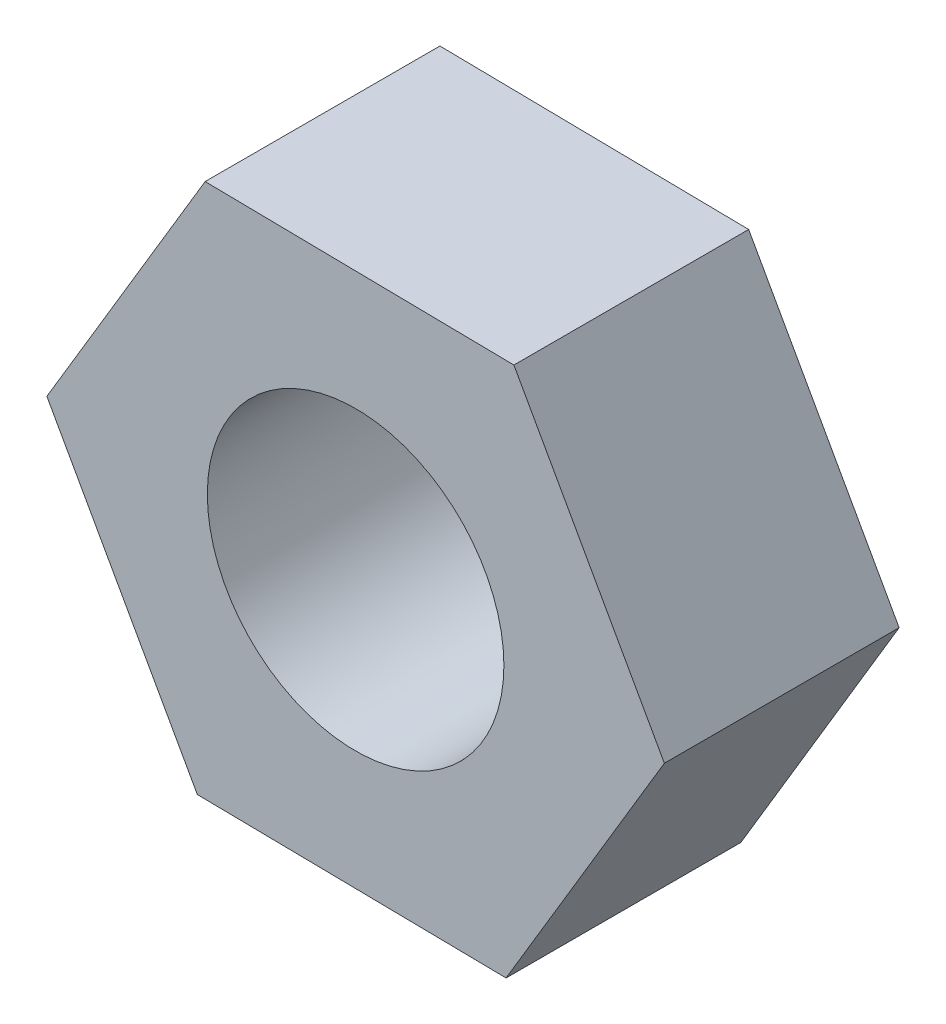
ISO-10303-21;
HEADER;
FILE_DESCRIPTION(('STEP AP214'),'2;1');
FILE_NAME('part.step','',(''),(''),'','','');
FILE_SCHEMA(('AUTOMOTIVE_DESIGN { 1 0 10303 214 1 1 1 1 }'));
ENDSEC;
DATA;
#1=APPLICATION_CONTEXT('core data for automotive mechanical design processes');
#2=APPLICATION_PROTOCOL_DEFINITION('international standard','automotive_design',2000,#1);
#3=PRODUCT_CONTEXT('',#1,'mechanical');
#4=PRODUCT('Part','Part','',(#3));
#5=PRODUCT_RELATED_PRODUCT_CATEGORY('part','',(#4));
#6=PRODUCT_DEFINITION_FORMATION('','',#4);
#7=PRODUCT_DEFINITION_CONTEXT('part definition',#1,'design');
#8=PRODUCT_DEFINITION('design','',#6,#7);
#9=PRODUCT_DEFINITION_SHAPE('','',#8);
#10=(LENGTH_UNIT() NAMED_UNIT(*) SI_UNIT(.MILLI.,.METRE.));
#11=(NAMED_UNIT(*) PLANE_ANGLE_UNIT() SI_UNIT($,.RADIAN.));
#12=(NAMED_UNIT(*) SI_UNIT($,.STERADIAN.) SOLID_ANGLE_UNIT());
#13=UNCERTAINTY_MEASURE_WITH_UNIT(LENGTH_MEASURE(1.E-05),#10,'distance_accuracy_value','');
#14=(GEOMETRIC_REPRESENTATION_CONTEXT(3) GLOBAL_UNCERTAINTY_ASSIGNED_CONTEXT((#13)) GLOBAL_UNIT_ASSIGNED_CONTEXT((#10,
#11,#12)) REPRESENTATION_CONTEXT('',''));
#15=CARTESIAN_POINT('',(0.,0.,0.));
#16=DIRECTION('',(0.,0.,1.));
#17=DIRECTION('',(1.,0.,0.));
#18=AXIS2_PLACEMENT_3D('',#15,#16,#17);
#19=CARTESIAN_POINT('',(3.1232464747736,-0.0456742576762376,2.3749));
#20=DIRECTION('',(-0.873244016784411,-0.487283169368928,0.));
#21=DIRECTION('',(0.487283169368928,-0.873244016784411,0.));
#22=AXIS2_PLACEMENT_3D('',#19,#20,#21);
#23=PLANE('',#22);
#24=DIRECTION('',(-0.487283169368928,0.873244016784411,0.));
#25=VECTOR('',#24,1.);
#26=CARTESIAN_POINT('',(3.1232464747736,-0.0456742576762376,0.));
#27=LINE('',#26,#25);
#28=CARTESIAN_POINT('',(3.1232464747736,-0.0456742576762376,0.));
#29=VERTEX_POINT('',#28);
#30=CARTESIAN_POINT('',(1.60117830483342,2.68197366059601,0.));
#31=VERTEX_POINT('',#30);
#32=EDGE_CURVE('E120',#29,#31,#27,.T.);
#33=ORIENTED_EDGE('',*,*,#32,.T.);
#34=DIRECTION('',(0.,0.,-1.));
#35=VECTOR('',#34,1.);
#36=CARTESIAN_POINT('',(1.60117830483342,2.68197366059601,2.3749));
#37=LINE('',#36,#35);
#38=CARTESIAN_POINT('',(1.60117830483342,2.68197366059601,2.3749));
#39=VERTEX_POINT('',#38);
#40=EDGE_CURVE('E11',#39,#31,#37,.T.);
#41=ORIENTED_EDGE('',*,*,#40,.F.);
#42=DIRECTION('',(-0.487283169368928,0.873244016784411,0.));
#43=VECTOR('',#42,1.);
#44=CARTESIAN_POINT('',(3.1232464747736,-0.0456742576762376,2.3749));
#45=LINE('',#44,#43);
#46=CARTESIAN_POINT('',(3.1232464747736,-0.0456742576762376,2.3749));
#47=VERTEX_POINT('',#46);
#48=EDGE_CURVE('E131',#47,#39,#45,.T.);
#49=ORIENTED_EDGE('',*,*,#48,.F.);
#50=DIRECTION('',(0.,0.,-1.));
#51=VECTOR('',#50,1.);
#52=CARTESIAN_POINT('',(3.1232464747736,-0.0456742576762376,2.3749));
#53=LINE('',#52,#51);
#54=EDGE_CURVE('E116',#47,#29,#53,.T.);
#55=ORIENTED_EDGE('',*,*,#54,.T.);
#56=EDGE_LOOP('',(#33,#41,#49,#55));
#57=FACE_BOUND('',#56,.T.);
#58=ADVANCED_FACE('F36',(#57),#23,.F.);
#59=CARTESIAN_POINT('',(1.60117830483342,2.68197366059601,2.3749));
#60=DIRECTION('',(-0.0146224048821186,-0.999893086922529,0.));
#61=DIRECTION('',(0.999893086922529,-0.0146224048821186,0.));
#62=AXIS2_PLACEMENT_3D('',#59,#60,#61);
#63=PLANE('',#62);
#64=DIRECTION('',(-0.999893086922529,0.0146224048821186,0.));
#65=VECTOR('',#64,1.);
#66=CARTESIAN_POINT('',(1.60117830483342,2.68197366059601,0.));
#67=LINE('',#66,#65);
#68=CARTESIAN_POINT('',(-1.52206816994018,2.72764791827225,0.));
#69=VERTEX_POINT('',#68);
#70=EDGE_CURVE('E123',#31,#69,#67,.T.);
#71=ORIENTED_EDGE('',*,*,#70,.T.);
#72=DIRECTION('',(0.,0.,-1.));
#73=VECTOR('',#72,1.);
#74=CARTESIAN_POINT('',(-1.52206816994018,2.72764791827225,2.3749));
#75=LINE('',#74,#73);
#76=CARTESIAN_POINT('',(-1.52206816994018,2.72764791827225,2.3749));
#77=VERTEX_POINT('',#76);
#78=EDGE_CURVE('E44',#77,#69,#75,.T.);
#79=ORIENTED_EDGE('',*,*,#78,.F.);
#80=DIRECTION('',(-0.999893086922529,0.0146224048821186,0.));
#81=VECTOR('',#80,1.);
#82=CARTESIAN_POINT('',(1.60117830483342,2.68197366059601,2.3749));
#83=LINE('',#82,#81);
#84=EDGE_CURVE('E89',#39,#77,#83,.T.);
#85=ORIENTED_EDGE('',*,*,#84,.F.);
#86=ORIENTED_EDGE('',*,*,#40,.T.);
#87=EDGE_LOOP('',(#71,#79,#85,#86));
#88=FACE_BOUND('',#87,.T.);
#89=ADVANCED_FACE('F156',(#88),#63,.F.);
#90=CARTESIAN_POINT('',(-1.52206816994018,2.72764791827225,2.3749));
#91=DIRECTION('',(0.858621611902292,-0.5126099175536,0.));
#92=DIRECTION('',(0.5126099175536,0.858621611902292,0.));
#93=AXIS2_PLACEMENT_3D('',#90,#91,#92);
#94=PLANE('',#93);
#95=DIRECTION('',(-0.5126099175536,-0.858621611902292,0.));
#96=VECTOR('',#95,1.);
#97=CARTESIAN_POINT('',(-1.52206816994018,2.72764791827225,0.));
#98=LINE('',#97,#96);
#99=CARTESIAN_POINT('',(-3.1232464747736,0.0456742576762379,0.));
#100=VERTEX_POINT('',#99);
#101=EDGE_CURVE('E126',#69,#100,#98,.T.);
#102=ORIENTED_EDGE('',*,*,#101,.T.);
#103=DIRECTION('',(0.,0.,-1.));
#104=VECTOR('',#103,1.);
#105=CARTESIAN_POINT('',(-3.1232464747736,0.0456742576762379,2.3749));
#106=LINE('',#105,#104);
#107=CARTESIAN_POINT('',(-3.1232464747736,0.0456742576762379,2.3749));
#108=VERTEX_POINT('',#107);
#109=EDGE_CURVE('E111',#108,#100,#106,.T.);
#110=ORIENTED_EDGE('',*,*,#109,.F.);
#111=DIRECTION('',(-0.5126099175536,-0.858621611902292,0.));
#112=VECTOR('',#111,1.);
#113=CARTESIAN_POINT('',(-1.52206816994018,2.72764791827225,2.3749));
#114=LINE('',#113,#112);
#115=EDGE_CURVE('E102',#77,#108,#114,.T.);
#116=ORIENTED_EDGE('',*,*,#115,.F.);
#117=ORIENTED_EDGE('',*,*,#78,.T.);
#118=EDGE_LOOP('',(#102,#110,#116,#117));
#119=FACE_BOUND('',#118,.T.);
#120=ADVANCED_FACE('F137',(#119),#94,.F.);
#121=CARTESIAN_POINT('',(-3.1232464747736,0.0456742576762379,2.3749));
#122=DIRECTION('',(0.873244016784411,0.487283169368928,0.));
#123=DIRECTION('',(-0.487283169368928,0.873244016784411,0.));
#124=AXIS2_PLACEMENT_3D('',#121,#122,#123);
#125=PLANE('',#124);
#126=DIRECTION('',(0.487283169368928,-0.873244016784411,0.));
#127=VECTOR('',#126,1.);
#128=CARTESIAN_POINT('',(-3.1232464747736,0.0456742576762379,0.));
#129=LINE('',#128,#127);
#130=CARTESIAN_POINT('',(-1.60117830483342,-2.68197366059601,0.));
#131=VERTEX_POINT('',#130);
#132=EDGE_CURVE('E110',#100,#131,#129,.T.);
#133=ORIENTED_EDGE('',*,*,#132,.T.);
#134=DIRECTION('',(0.,0.,-1.));
#135=VECTOR('',#134,1.);
#136=CARTESIAN_POINT('',(-1.60117830483342,-2.68197366059601,2.3749));
#137=LINE('',#136,#135);
#138=CARTESIAN_POINT('',(-1.60117830483342,-2.68197366059601,2.3749));
#139=VERTEX_POINT('',#138);
#140=EDGE_CURVE('E107',#139,#131,#137,.T.);
#141=ORIENTED_EDGE('',*,*,#140,.F.);
#142=DIRECTION('',(0.487283169368928,-0.873244016784411,0.));
#143=VECTOR('',#142,1.);
#144=CARTESIAN_POINT('',(-3.1232464747736,0.0456742576762379,2.3749));
#145=LINE('',#144,#143);
#146=EDGE_CURVE('E96',#108,#139,#145,.T.);
#147=ORIENTED_EDGE('',*,*,#146,.F.);
#148=ORIENTED_EDGE('',*,*,#109,.T.);
#149=EDGE_LOOP('',(#133,#141,#147,#148));
#150=FACE_BOUND('',#149,.T.);
#151=ADVANCED_FACE('F108',(#150),#125,.F.);
#152=CARTESIAN_POINT('',(-1.60117830483342,-2.68197366059601,2.3749));
#153=DIRECTION('',(0.0146224048821178,0.999893086922529,0.));
#154=DIRECTION('',(-0.999893086922529,0.0146224048821178,0.));
#155=AXIS2_PLACEMENT_3D('',#152,#153,#154);
#156=PLANE('',#155);
#157=DIRECTION('',(0.999893086922529,-0.0146224048821178,0.));
#158=VECTOR('',#157,1.);
#159=CARTESIAN_POINT('',(-1.60117830483342,-2.68197366059601,0.));
#160=LINE('',#159,#158);
#161=CARTESIAN_POINT('',(1.52206816994018,-2.72764791827225,0.));
#162=VERTEX_POINT('',#161);
#163=EDGE_CURVE('E75',#131,#162,#160,.T.);
#164=ORIENTED_EDGE('',*,*,#163,.T.);
#165=DIRECTION('',(0.,0.,-1.));
#166=VECTOR('',#165,1.);
#167=CARTESIAN_POINT('',(1.52206816994018,-2.72764791827225,2.3749));
#168=LINE('',#167,#166);
#169=CARTESIAN_POINT('',(1.52206816994018,-2.72764791827225,2.3749));
#170=VERTEX_POINT('',#169);
#171=EDGE_CURVE('E112',#170,#162,#168,.T.);
#172=ORIENTED_EDGE('',*,*,#171,.F.);
#173=DIRECTION('',(0.999893086922529,-0.0146224048821178,0.));
#174=VECTOR('',#173,1.);
#175=CARTESIAN_POINT('',(-1.60117830483342,-2.68197366059601,2.3749));
#176=LINE('',#175,#174);
#177=EDGE_CURVE('E100',#139,#170,#176,.T.);
#178=ORIENTED_EDGE('',*,*,#177,.F.);
#179=ORIENTED_EDGE('',*,*,#140,.T.);
#180=EDGE_LOOP('',(#164,#172,#178,#179));
#181=FACE_BOUND('',#180,.T.);
#182=ADVANCED_FACE('F114',(#181),#156,.F.);
#183=CARTESIAN_POINT('',(1.52206816994018,-2.72764791827225,2.3749));
#184=DIRECTION('',(-0.858621611902292,0.5126099175536,0.));
#185=DIRECTION('',(-0.5126099175536,-0.858621611902292,0.));
#186=AXIS2_PLACEMENT_3D('',#183,#184,#185);
#187=PLANE('',#186);
#188=DIRECTION('',(0.5126099175536,0.858621611902292,0.));
#189=VECTOR('',#188,1.);
#190=CARTESIAN_POINT('',(1.52206816994018,-2.72764791827225,0.));
#191=LINE('',#190,#189);
#192=EDGE_CURVE('E81',#162,#29,#191,.T.);
#193=ORIENTED_EDGE('',*,*,#192,.T.);
#194=ORIENTED_EDGE('',*,*,#54,.F.);
#195=DIRECTION('',(0.5126099175536,0.858621611902292,0.));
#196=VECTOR('',#195,1.);
#197=CARTESIAN_POINT('',(1.52206816994018,-2.72764791827225,2.3749));
#198=LINE('',#197,#196);
#199=EDGE_CURVE('E52',#170,#47,#198,.T.);
#200=ORIENTED_EDGE('',*,*,#199,.F.);
#201=ORIENTED_EDGE('',*,*,#171,.T.);
#202=EDGE_LOOP('',(#193,#194,#200,#201));
#203=FACE_BOUND('',#202,.T.);
#204=ADVANCED_FACE('F144',(#203),#187,.F.);
#205=CARTESIAN_POINT('',(0.,0.,2.3749));
#206=DIRECTION('',(0.,0.,1.));
#207=DIRECTION('',(1.,0.,0.));
#208=AXIS2_PLACEMENT_3D('',#205,#206,#207);
#209=PLANE('',#208);
#210=CARTESIAN_POINT('',(0.,0.,2.3749));
#211=DIRECTION('',(0.,0.,1.));
#212=DIRECTION('',(1.,0.,0.));
#213=AXIS2_PLACEMENT_3D('',#210,#211,#212);
#214=CIRCLE('',#213,1.5);
#215=CARTESIAN_POINT('',(1.5,0.,2.3749));
#216=VERTEX_POINT('',#215);
#217=EDGE_CURVE('E211',#216,#216,#214,.T.);
#218=ORIENTED_EDGE('',*,*,#217,.F.);
#219=EDGE_LOOP('',(#218));
#220=FACE_BOUND('',#219,.T.);
#221=ORIENTED_EDGE('',*,*,#48,.T.);
#222=ORIENTED_EDGE('',*,*,#84,.T.);
#223=ORIENTED_EDGE('',*,*,#115,.T.);
#224=ORIENTED_EDGE('',*,*,#146,.T.);
#225=ORIENTED_EDGE('',*,*,#177,.T.);
#226=ORIENTED_EDGE('',*,*,#199,.T.);
#227=EDGE_LOOP('',(#221,#222,#223,#224,#225,#226));
#228=FACE_BOUND('',#227,.T.);
#229=ADVANCED_FACE('F98',(#220,#228),#209,.T.);
#230=CARTESIAN_POINT('',(0.,0.,0.));
#231=DIRECTION('',(0.,0.,1.));
#232=DIRECTION('',(1.,0.,0.));
#233=AXIS2_PLACEMENT_3D('',#230,#231,#232);
#234=PLANE('',#233);
#235=CARTESIAN_POINT('',(0.,0.,0.));
#236=DIRECTION('',(0.,0.,1.));
#237=DIRECTION('',(1.,0.,0.));
#238=AXIS2_PLACEMENT_3D('',#235,#236,#237);
#239=CIRCLE('',#238,1.5);
#240=CARTESIAN_POINT('',(1.5,0.,0.));
#241=VERTEX_POINT('',#240);
#242=EDGE_CURVE('E124',#241,#241,#239,.T.);
#243=ORIENTED_EDGE('',*,*,#242,.T.);
#244=EDGE_LOOP('',(#243));
#245=FACE_BOUND('',#244,.T.);
#246=ORIENTED_EDGE('',*,*,#32,.F.);
#247=ORIENTED_EDGE('',*,*,#192,.F.);
#248=ORIENTED_EDGE('',*,*,#163,.F.);
#249=ORIENTED_EDGE('',*,*,#132,.F.);
#250=ORIENTED_EDGE('',*,*,#101,.F.);
#251=ORIENTED_EDGE('',*,*,#70,.F.);
#252=EDGE_LOOP('',(#246,#247,#248,#249,#250,#251));
#253=FACE_BOUND('',#252,.T.);
#254=ADVANCED_FACE('F140',(#245,#253),#234,.F.);
#255=CARTESIAN_POINT('',(0.,0.,0.));
#256=DIRECTION('',(0.,0.,1.));
#257=DIRECTION('',(1.,0.,0.));
#258=AXIS2_PLACEMENT_3D('',#255,#256,#257);
#259=CYLINDRICAL_SURFACE('',#258,1.5);
#260=ORIENTED_EDGE('',*,*,#242,.F.);
#261=EDGE_LOOP('',(#260));
#262=FACE_BOUND('',#261,.T.);
#263=ORIENTED_EDGE('',*,*,#217,.T.);
#264=EDGE_LOOP('',(#263));
#265=FACE_BOUND('',#264,.T.);
#266=ADVANCED_FACE('F193',(#262,#265),#259,.F.);
#267=CLOSED_SHELL('',(#58,#89,#120,#151,#182,#204,#229,#254,#266));
#268=MANIFOLD_SOLID_BREP('B2',#267);
#269=ADVANCED_BREP_SHAPE_REPRESENTATION('',(#18,#268),#14);
#270=SHAPE_DEFINITION_REPRESENTATION(#9,#269);
ENDSEC;
END-ISO-10303-21;
